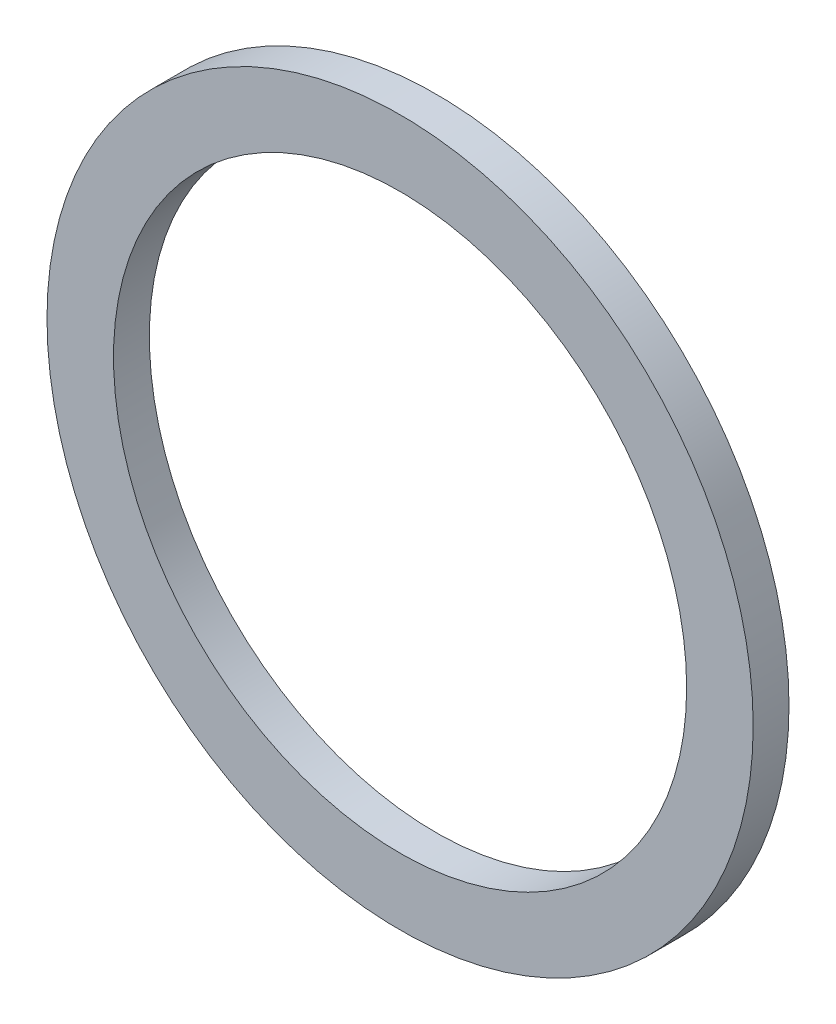
ISO-10303-21;
HEADER;
FILE_DESCRIPTION(('STEP AP214'),'2;1');
FILE_NAME('part.step','',(''),(''),'','','');
FILE_SCHEMA(('AUTOMOTIVE_DESIGN { 1 0 10303 214 1 1 1 1 }'));
ENDSEC;
DATA;
#1=APPLICATION_CONTEXT('core data for automotive mechanical design processes');
#2=APPLICATION_PROTOCOL_DEFINITION('international standard','automotive_design',2000,#1);
#3=PRODUCT_CONTEXT('',#1,'mechanical');
#4=PRODUCT('Part','Part','',(#3));
#5=PRODUCT_RELATED_PRODUCT_CATEGORY('part','',(#4));
#6=PRODUCT_DEFINITION_FORMATION('','',#4);
#7=PRODUCT_DEFINITION_CONTEXT('part definition',#1,'design');
#8=PRODUCT_DEFINITION('design','',#6,#7);
#9=PRODUCT_DEFINITION_SHAPE('','',#8);
#10=(LENGTH_UNIT() NAMED_UNIT(*) SI_UNIT(.MILLI.,.METRE.));
#11=(NAMED_UNIT(*) PLANE_ANGLE_UNIT() SI_UNIT($,.RADIAN.));
#12=(NAMED_UNIT(*) SI_UNIT($,.STERADIAN.) SOLID_ANGLE_UNIT());
#13=UNCERTAINTY_MEASURE_WITH_UNIT(LENGTH_MEASURE(1.E-05),#10,'distance_accuracy_value','');
#14=(GEOMETRIC_REPRESENTATION_CONTEXT(3) GLOBAL_UNCERTAINTY_ASSIGNED_CONTEXT((#13)) GLOBAL_UNIT_ASSIGNED_CONTEXT((#10,
#11,#12)) REPRESENTATION_CONTEXT('',''));
#15=CARTESIAN_POINT('',(0.,0.,0.));
#16=DIRECTION('',(0.,0.,1.));
#17=DIRECTION('',(1.,0.,0.));
#18=AXIS2_PLACEMENT_3D('',#15,#16,#17);
#19=CARTESIAN_POINT('',(0.,0.,1.75));
#20=DIRECTION('',(0.,0.,1.));
#21=DIRECTION('',(1.,0.,0.));
#22=AXIS2_PLACEMENT_3D('',#19,#20,#21);
#23=PLANE('',#22);
#24=CARTESIAN_POINT('',(0.,0.,1.75));
#25=DIRECTION('',(0.,0.,1.));
#26=DIRECTION('',(1.,0.,0.));
#27=AXIS2_PLACEMENT_3D('',#24,#25,#26);
#28=CIRCLE('',#27,17.25);
#29=CARTESIAN_POINT('',(17.25,0.,1.75));
#30=VERTEX_POINT('',#29);
#31=EDGE_CURVE('E10',#30,#30,#28,.T.);
#32=ORIENTED_EDGE('',*,*,#31,.T.);
#33=EDGE_LOOP('',(#32));
#34=FACE_BOUND('',#33,.T.);
#35=CARTESIAN_POINT('',(0.,0.,1.75));
#36=DIRECTION('',(0.,0.,1.));
#37=DIRECTION('',(1.,0.,0.));
#38=AXIS2_PLACEMENT_3D('',#35,#36,#37);
#39=CIRCLE('',#38,14.);
#40=CARTESIAN_POINT('',(14.,0.,1.75));
#41=VERTEX_POINT('',#40);
#42=EDGE_CURVE('E46',#41,#41,#39,.T.);
#43=ORIENTED_EDGE('',*,*,#42,.F.);
#44=EDGE_LOOP('',(#43));
#45=FACE_BOUND('',#44,.T.);
#46=ADVANCED_FACE('F35',(#34,#45),#23,.T.);
#47=CARTESIAN_POINT('',(0.,0.,0.));
#48=DIRECTION('',(0.,0.,1.));
#49=DIRECTION('',(1.,0.,0.));
#50=AXIS2_PLACEMENT_3D('',#47,#48,#49);
#51=PLANE('',#50);
#52=CARTESIAN_POINT('',(0.,0.,0.));
#53=DIRECTION('',(0.,0.,1.));
#54=DIRECTION('',(1.,0.,0.));
#55=AXIS2_PLACEMENT_3D('',#52,#53,#54);
#56=CIRCLE('',#55,17.25);
#57=CARTESIAN_POINT('',(17.25,0.,0.));
#58=VERTEX_POINT('',#57);
#59=EDGE_CURVE('E39',#58,#58,#56,.T.);
#60=ORIENTED_EDGE('',*,*,#59,.F.);
#61=EDGE_LOOP('',(#60));
#62=FACE_BOUND('',#61,.T.);
#63=CARTESIAN_POINT('',(0.,0.,0.));
#64=DIRECTION('',(0.,0.,1.));
#65=DIRECTION('',(1.,0.,0.));
#66=AXIS2_PLACEMENT_3D('',#63,#64,#65);
#67=CIRCLE('',#66,14.);
#68=CARTESIAN_POINT('',(14.,0.,0.));
#69=VERTEX_POINT('',#68);
#70=EDGE_CURVE('E48',#69,#69,#67,.T.);
#71=ORIENTED_EDGE('',*,*,#70,.T.);
#72=EDGE_LOOP('',(#71));
#73=FACE_BOUND('',#72,.T.);
#74=ADVANCED_FACE('F58',(#62,#73),#51,.F.);
#75=CARTESIAN_POINT('',(0.,0.,1.75));
#76=DIRECTION('',(0.,0.,-1.));
#77=DIRECTION('',(-1.,0.,0.));
#78=AXIS2_PLACEMENT_3D('',#75,#76,#77);
#79=CYLINDRICAL_SURFACE('',#78,17.25);
#80=ORIENTED_EDGE('',*,*,#31,.F.);
#81=EDGE_LOOP('',(#80));
#82=FACE_BOUND('',#81,.T.);
#83=ORIENTED_EDGE('',*,*,#59,.T.);
#84=EDGE_LOOP('',(#83));
#85=FACE_BOUND('',#84,.T.);
#86=ADVANCED_FACE('F37',(#82,#85),#79,.T.);
#87=CARTESIAN_POINT('',(0.,0.,1.75));
#88=DIRECTION('',(0.,0.,-1.));
#89=DIRECTION('',(-1.,0.,0.));
#90=AXIS2_PLACEMENT_3D('',#87,#88,#89);
#91=CYLINDRICAL_SURFACE('',#90,14.);
#92=ORIENTED_EDGE('',*,*,#42,.T.);
#93=EDGE_LOOP('',(#92));
#94=FACE_BOUND('',#93,.T.);
#95=ORIENTED_EDGE('',*,*,#70,.F.);
#96=EDGE_LOOP('',(#95));
#97=FACE_BOUND('',#96,.T.);
#98=ADVANCED_FACE('F54',(#94,#97),#91,.F.);
#99=CLOSED_SHELL('',(#46,#74,#86,#98));
#100=MANIFOLD_SOLID_BREP('B2',#99);
#101=ADVANCED_BREP_SHAPE_REPRESENTATION('',(#18,#100),#14);
#102=SHAPE_DEFINITION_REPRESENTATION(#9,#101);
ENDSEC;
END-ISO-10303-21;
